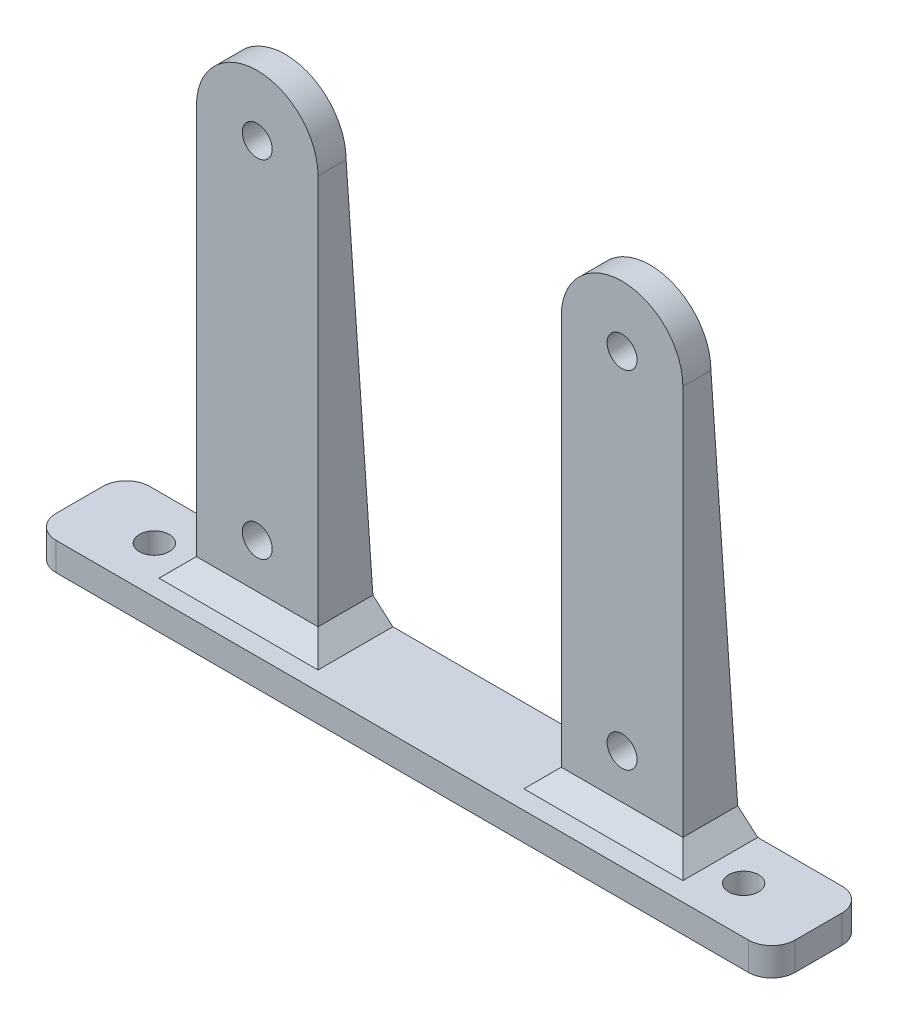
ISO-10303-21;
HEADER;
FILE_DESCRIPTION(('STEP AP214'),'2;1');
FILE_NAME('part.step','',(''),(''),'','','');
FILE_SCHEMA(('AUTOMOTIVE_DESIGN { 1 0 10303 214 1 1 1 1 }'));
ENDSEC;
DATA;
#1=APPLICATION_CONTEXT('core data for automotive mechanical design processes');
#2=APPLICATION_PROTOCOL_DEFINITION('international standard','automotive_design',2000,#1);
#3=PRODUCT_CONTEXT('',#1,'mechanical');
#4=PRODUCT('Part','Part','',(#3));
#5=PRODUCT_RELATED_PRODUCT_CATEGORY('part','',(#4));
#6=PRODUCT_DEFINITION_FORMATION('','',#4);
#7=PRODUCT_DEFINITION_CONTEXT('part definition',#1,'design');
#8=PRODUCT_DEFINITION('design','',#6,#7);
#9=PRODUCT_DEFINITION_SHAPE('','',#8);
#10=(LENGTH_UNIT() NAMED_UNIT(*) SI_UNIT(.MILLI.,.METRE.));
#11=(NAMED_UNIT(*) PLANE_ANGLE_UNIT() SI_UNIT($,.RADIAN.));
#12=(NAMED_UNIT(*) SI_UNIT($,.STERADIAN.) SOLID_ANGLE_UNIT());
#13=UNCERTAINTY_MEASURE_WITH_UNIT(LENGTH_MEASURE(1.E-05),#10,'distance_accuracy_value','');
#14=(GEOMETRIC_REPRESENTATION_CONTEXT(3) GLOBAL_UNCERTAINTY_ASSIGNED_CONTEXT((#13)) GLOBAL_UNIT_ASSIGNED_CONTEXT((#10,
#11,#12)) REPRESENTATION_CONTEXT('',''));
#15=CARTESIAN_POINT('',(0.,0.,0.));
#16=DIRECTION('',(0.,0.,1.));
#17=DIRECTION('',(1.,0.,0.));
#18=AXIS2_PLACEMENT_3D('',#15,#16,#17);
#19=CARTESIAN_POINT('',(0.,3.,0.));
#20=DIRECTION('',(0.,-1.,0.));
#21=DIRECTION('',(0.,0.,-1.));
#22=AXIS2_PLACEMENT_3D('',#19,#20,#21);
#23=PLANE('',#22);
#24=DIRECTION('',(0.,0.,-1.));
#25=VECTOR('',#24,1.);
#26=CARTESIAN_POINT('',(54.5,3.,0.));
#27=LINE('',#26,#25);
#28=CARTESIAN_POINT('',(54.5,3.,-7.));
#29=VERTEX_POINT('',#28);
#30=CARTESIAN_POINT('',(54.5,2.99999999999961,-10.));
#31=VERTEX_POINT('',#30);
#32=EDGE_CURVE('E123',#29,#31,#27,.T.);
#33=ORIENTED_EDGE('',*,*,#32,.F.);
#34=DIRECTION('',(1.,0.,0.));
#35=VECTOR('',#34,1.);
#36=CARTESIAN_POINT('',(52.5,3.,-7.));
#37=LINE('',#36,#35);
#38=CARTESIAN_POINT('',(63.5,3.,-7.));
#39=VERTEX_POINT('',#38);
#40=EDGE_CURVE('E90',#29,#39,#37,.T.);
#41=ORIENTED_EDGE('',*,*,#40,.T.);
#42=DIRECTION('',(0.,0.,1.));
#43=VECTOR('',#42,1.);
#44=CARTESIAN_POINT('',(63.5,3.,0.));
#45=LINE('',#44,#43);
#46=CARTESIAN_POINT('',(63.5,3.00000000000003,-10.));
#47=VERTEX_POINT('',#46);
#48=EDGE_CURVE('E166',#47,#39,#45,.T.);
#49=ORIENTED_EDGE('',*,*,#48,.F.);
#50=DIRECTION('',(-1.,0.,0.));
#51=VECTOR('',#50,1.);
#52=CARTESIAN_POINT('',(0.,3.,-10.));
#53=LINE('',#52,#51);
#54=EDGE_CURVE('E290',#47,#31,#53,.T.);
#55=ORIENTED_EDGE('',*,*,#54,.T.);
#56=EDGE_LOOP('',(#33,#41,#49,#55));
#57=FACE_BOUND('',#56,.T.);
#58=ADVANCED_FACE('F37',(#57),#23,.F.);
#59=DIRECTION('',(0.,0.,1.));
#60=VECTOR('',#59,1.);
#61=CARTESIAN_POINT('',(24.5,3.,0.));
#62=LINE('',#61,#60);
#63=CARTESIAN_POINT('',(24.5,3.,-10.));
#64=VERTEX_POINT('',#63);
#65=CARTESIAN_POINT('',(24.5,3.,-7.));
#66=VERTEX_POINT('',#65);
#67=EDGE_CURVE('E222',#64,#66,#62,.T.);
#68=ORIENTED_EDGE('',*,*,#67,.F.);
#69=CARTESIAN_POINT('',(15.5,3.,-10.));
#70=VERTEX_POINT('',#69);
#71=EDGE_CURVE('E292',#64,#70,#53,.T.);
#72=ORIENTED_EDGE('',*,*,#71,.T.);
#73=DIRECTION('',(0.,0.,-1.));
#74=VECTOR('',#73,1.);
#75=CARTESIAN_POINT('',(15.5,3.,0.));
#76=LINE('',#75,#74);
#77=CARTESIAN_POINT('',(15.5,3.,-7.));
#78=VERTEX_POINT('',#77);
#79=EDGE_CURVE('E240',#78,#70,#76,.T.);
#80=ORIENTED_EDGE('',*,*,#79,.F.);
#81=DIRECTION('',(-1.,0.,0.));
#82=VECTOR('',#81,1.);
#83=CARTESIAN_POINT('',(26.5,3.,-7.));
#84=LINE('',#83,#82);
#85=EDGE_CURVE('E258',#66,#78,#84,.T.);
#86=ORIENTED_EDGE('',*,*,#85,.F.);
#87=EDGE_LOOP('',(#68,#72,#80,#86));
#88=FACE_BOUND('',#87,.T.);
#89=ADVANCED_FACE('F552',(#88),#23,.F.);
#90=DIRECTION('',(-1.,0.,0.));
#91=VECTOR('',#90,1.);
#92=CARTESIAN_POINT('',(0.,3.,-2.));
#93=LINE('',#92,#91);
#94=CARTESIAN_POINT('',(67.5,3.,-2.));
#95=VERTEX_POINT('',#94);
#96=CARTESIAN_POINT('',(50.5,3.,-2.));
#97=VERTEX_POINT('',#96);
#98=EDGE_CURVE('E374',#95,#97,#93,.T.);
#99=ORIENTED_EDGE('',*,*,#98,.T.);
#100=DIRECTION('',(0.,0.,-1.));
#101=VECTOR('',#100,1.);
#102=CARTESIAN_POINT('',(50.5,3.,0.));
#103=LINE('',#102,#101);
#104=CARTESIAN_POINT('',(50.5,3.00000000000001,-10.));
#105=VERTEX_POINT('',#104);
#106=EDGE_CURVE('E130',#97,#105,#103,.T.);
#107=ORIENTED_EDGE('',*,*,#106,.T.);
#108=CARTESIAN_POINT('',(28.5,3.,-10.));
#109=VERTEX_POINT('',#108);
#110=EDGE_CURVE('E291',#105,#109,#53,.T.);
#111=ORIENTED_EDGE('',*,*,#110,.T.);
#112=DIRECTION('',(0.,0.,1.));
#113=VECTOR('',#112,1.);
#114=CARTESIAN_POINT('',(28.5,3.,-4.));
#115=LINE('',#114,#113);
#116=CARTESIAN_POINT('',(28.5,3.,-2.00000000000001));
#117=VERTEX_POINT('',#116);
#118=EDGE_CURVE('E359',#109,#117,#115,.T.);
#119=ORIENTED_EDGE('',*,*,#118,.T.);
#120=DIRECTION('',(-1.,0.,0.));
#121=VECTOR('',#120,1.);
#122=CARTESIAN_POINT('',(13.5,3.,-2.00000000000001));
#123=LINE('',#122,#121);
#124=CARTESIAN_POINT('',(11.5,3.,-2.00000000000001));
#125=VERTEX_POINT('',#124);
#126=EDGE_CURVE('E353',#117,#125,#123,.T.);
#127=ORIENTED_EDGE('',*,*,#126,.T.);
#128=DIRECTION('',(0.,0.,-1.));
#129=VECTOR('',#128,1.);
#130=CARTESIAN_POINT('',(11.5,3.,-10.));
#131=LINE('',#130,#129);
#132=CARTESIAN_POINT('',(11.5,3.00000000000003,-10.));
#133=VERTEX_POINT('',#132);
#134=EDGE_CURVE('E356',#125,#133,#131,.T.);
#135=ORIENTED_EDGE('',*,*,#134,.T.);
#136=CARTESIAN_POINT('',(2.5,3.,-10.));
#137=VERTEX_POINT('',#136);
#138=EDGE_CURVE('E286',#133,#137,#53,.T.);
#139=ORIENTED_EDGE('',*,*,#138,.T.);
#140=CARTESIAN_POINT('',(2.5,3.,-7.5));
#141=DIRECTION('',(0.,-1.,0.));
#142=DIRECTION('',(0.,0.,-1.));
#143=AXIS2_PLACEMENT_3D('',#140,#141,#142);
#144=CIRCLE('',#143,2.5);
#145=CARTESIAN_POINT('',(0.,3.,-7.5));
#146=VERTEX_POINT('',#145);
#147=EDGE_CURVE('E335',#137,#146,#144,.F.);
#148=ORIENTED_EDGE('',*,*,#147,.T.);
#149=DIRECTION('',(0.,0.,1.));
#150=VECTOR('',#149,1.);
#151=CARTESIAN_POINT('',(0.,3.,0.));
#152=LINE('',#151,#150);
#153=CARTESIAN_POINT('',(0.,3.,-2.5));
#154=VERTEX_POINT('',#153);
#155=EDGE_CURVE('E276',#146,#154,#152,.T.);
#156=ORIENTED_EDGE('',*,*,#155,.T.);
#157=CARTESIAN_POINT('',(2.5,3.,-2.5));
#158=DIRECTION('',(0.,-1.,0.));
#159=DIRECTION('',(0.,0.,-1.));
#160=AXIS2_PLACEMENT_3D('',#157,#158,#159);
#161=CIRCLE('',#160,2.5);
#162=CARTESIAN_POINT('',(2.5,3.,0.));
#163=VERTEX_POINT('',#162);
#164=EDGE_CURVE('E326',#154,#163,#161,.F.);
#165=ORIENTED_EDGE('',*,*,#164,.T.);
#166=DIRECTION('',(1.,0.,0.));
#167=VECTOR('',#166,1.);
#168=CARTESIAN_POINT('',(0.,3.,0.));
#169=LINE('',#168,#167);
#170=CARTESIAN_POINT('',(76.5,3.,0.));
#171=VERTEX_POINT('',#170);
#172=EDGE_CURVE('E279',#163,#171,#169,.T.);
#173=ORIENTED_EDGE('',*,*,#172,.T.);
#174=CARTESIAN_POINT('',(76.5,3.,-2.5));
#175=DIRECTION('',(0.,-1.,0.));
#176=DIRECTION('',(0.,0.,-1.));
#177=AXIS2_PLACEMENT_3D('',#174,#175,#176);
#178=CIRCLE('',#177,2.5);
#179=CARTESIAN_POINT('',(79.,3.,-2.5));
#180=VERTEX_POINT('',#179);
#181=EDGE_CURVE('E329',#171,#180,#178,.F.);
#182=ORIENTED_EDGE('',*,*,#181,.T.);
#183=DIRECTION('',(0.,0.,-1.));
#184=VECTOR('',#183,1.);
#185=CARTESIAN_POINT('',(79.,3.,0.));
#186=LINE('',#185,#184);
#187=CARTESIAN_POINT('',(79.,3.,-7.5));
#188=VERTEX_POINT('',#187);
#189=EDGE_CURVE('E283',#180,#188,#186,.T.);
#190=ORIENTED_EDGE('',*,*,#189,.T.);
#191=CARTESIAN_POINT('',(76.5,3.,-7.5));
#192=DIRECTION('',(0.,-1.,0.));
#193=DIRECTION('',(0.,0.,-1.));
#194=AXIS2_PLACEMENT_3D('',#191,#192,#193);
#195=CIRCLE('',#194,2.5);
#196=CARTESIAN_POINT('',(76.5,3.,-10.));
#197=VERTEX_POINT('',#196);
#198=EDGE_CURVE('E332',#188,#197,#195,.F.);
#199=ORIENTED_EDGE('',*,*,#198,.T.);
#200=CARTESIAN_POINT('',(67.5,3.,-10.));
#201=VERTEX_POINT('',#200);
#202=EDGE_CURVE('E287',#197,#201,#53,.T.);
#203=ORIENTED_EDGE('',*,*,#202,.T.);
#204=DIRECTION('',(0.,0.,1.));
#205=VECTOR('',#204,1.);
#206=CARTESIAN_POINT('',(67.5,3.,0.));
#207=LINE('',#206,#205);
#208=EDGE_CURVE('E133',#201,#95,#207,.T.);
#209=ORIENTED_EDGE('',*,*,#208,.T.);
#210=EDGE_LOOP('',(#99,#107,#111,#119,#127,#135,#139,#148,#156,#165,#173,#182,#190,#199,#203,#209));
#211=FACE_BOUND('',#210,.T.);
#212=CARTESIAN_POINT('',(8.,3.,-5.));
#213=DIRECTION('',(0.,1.,0.));
#214=DIRECTION('',(0.,0.,1.));
#215=AXIS2_PLACEMENT_3D('',#212,#213,#214);
#216=CIRCLE('',#215,1.6);
#217=CARTESIAN_POINT('',(8.,3.,-3.4));
#218=VERTEX_POINT('',#217);
#219=EDGE_CURVE('E203',#218,#218,#216,.T.);
#220=ORIENTED_EDGE('',*,*,#219,.F.);
#221=EDGE_LOOP('',(#220));
#222=FACE_BOUND('',#221,.T.);
#223=CARTESIAN_POINT('',(71.,3.,-5.));
#224=DIRECTION('',(0.,1.,0.));
#225=DIRECTION('',(0.,0.,1.));
#226=AXIS2_PLACEMENT_3D('',#223,#224,#225);
#227=CIRCLE('',#226,1.60000000000001);
#228=CARTESIAN_POINT('',(71.,3.,-3.4));
#229=VERTEX_POINT('',#228);
#230=EDGE_CURVE('E197',#229,#229,#227,.T.);
#231=ORIENTED_EDGE('',*,*,#230,.F.);
#232=EDGE_LOOP('',(#231));
#233=FACE_BOUND('',#232,.T.);
#234=ADVANCED_FACE('F381',(#211,#222,#233),#23,.F.);
#235=CARTESIAN_POINT('',(0.,3.,0.));
#236=DIRECTION('',(1.,0.,0.));
#237=DIRECTION('',(0.,0.,-1.));
#238=AXIS2_PLACEMENT_3D('',#235,#236,#237);
#239=PLANE('',#238);
#240=ORIENTED_EDGE('',*,*,#155,.F.);
#241=DIRECTION('',(0.,-1.,0.));
#242=VECTOR('',#241,1.);
#243=CARTESIAN_POINT('',(0.,3.,-7.5));
#244=LINE('',#243,#242);
#245=CARTESIAN_POINT('',(0.,0.,-7.5));
#246=VERTEX_POINT('',#245);
#247=EDGE_CURVE('E305',#146,#246,#244,.T.);
#248=ORIENTED_EDGE('',*,*,#247,.T.);
#249=DIRECTION('',(0.,0.,1.));
#250=VECTOR('',#249,1.);
#251=CARTESIAN_POINT('',(0.,0.,0.));
#252=LINE('',#251,#250);
#253=CARTESIAN_POINT('',(0.,0.,-2.5));
#254=VERTEX_POINT('',#253);
#255=EDGE_CURVE('E275',#246,#254,#252,.T.);
#256=ORIENTED_EDGE('',*,*,#255,.T.);
#257=DIRECTION('',(0.,-1.,0.));
#258=VECTOR('',#257,1.);
#259=CARTESIAN_POINT('',(0.,3.,-2.5));
#260=LINE('',#259,#258);
#261=EDGE_CURVE('E289',#254,#154,#260,.F.);
#262=ORIENTED_EDGE('',*,*,#261,.T.);
#263=EDGE_LOOP('',(#240,#248,#256,#262));
#264=FACE_BOUND('',#263,.T.);
#265=ADVANCED_FACE('F421',(#264),#239,.F.);
#266=CARTESIAN_POINT('',(0.,3.,0.));
#267=DIRECTION('',(0.,0.,-1.));
#268=DIRECTION('',(-1.,0.,0.));
#269=AXIS2_PLACEMENT_3D('',#266,#267,#268);
#270=PLANE('',#269);
#271=DIRECTION('',(1.,0.,0.));
#272=VECTOR('',#271,1.);
#273=CARTESIAN_POINT('',(0.,0.,0.));
#274=LINE('',#273,#272);
#275=CARTESIAN_POINT('',(2.5,0.,0.));
#276=VERTEX_POINT('',#275);
#277=CARTESIAN_POINT('',(76.5,0.,0.));
#278=VERTEX_POINT('',#277);
#279=EDGE_CURVE('E295',#276,#278,#274,.T.);
#280=ORIENTED_EDGE('',*,*,#279,.T.);
#281=DIRECTION('',(0.,-1.,0.));
#282=VECTOR('',#281,1.);
#283=CARTESIAN_POINT('',(76.5,3.,0.));
#284=LINE('',#283,#282);
#285=EDGE_CURVE('E347',#278,#171,#284,.F.);
#286=ORIENTED_EDGE('',*,*,#285,.T.);
#287=ORIENTED_EDGE('',*,*,#172,.F.);
#288=DIRECTION('',(0.,-1.,0.));
#289=VECTOR('',#288,1.);
#290=CARTESIAN_POINT('',(2.5,3.,0.));
#291=LINE('',#290,#289);
#292=EDGE_CURVE('E344',#163,#276,#291,.T.);
#293=ORIENTED_EDGE('',*,*,#292,.T.);
#294=EDGE_LOOP('',(#280,#286,#287,#293));
#295=FACE_BOUND('',#294,.T.);
#296=ADVANCED_FACE('F442',(#295),#270,.F.);
#297=CARTESIAN_POINT('',(79.,3.,0.));
#298=DIRECTION('',(-1.,0.,0.));
#299=DIRECTION('',(0.,0.,1.));
#300=AXIS2_PLACEMENT_3D('',#297,#298,#299);
#301=PLANE('',#300);
#302=DIRECTION('',(0.,0.,-1.));
#303=VECTOR('',#302,1.);
#304=CARTESIAN_POINT('',(79.,0.,0.));
#305=LINE('',#304,#303);
#306=CARTESIAN_POINT('',(79.,0.,-2.5));
#307=VERTEX_POINT('',#306);
#308=CARTESIAN_POINT('',(79.,0.,-7.5));
#309=VERTEX_POINT('',#308);
#310=EDGE_CURVE('E298',#307,#309,#305,.T.);
#311=ORIENTED_EDGE('',*,*,#310,.T.);
#312=DIRECTION('',(0.,-1.,0.));
#313=VECTOR('',#312,1.);
#314=CARTESIAN_POINT('',(79.,3.,-7.5));
#315=LINE('',#314,#313);
#316=EDGE_CURVE('E341',#309,#188,#315,.F.);
#317=ORIENTED_EDGE('',*,*,#316,.T.);
#318=ORIENTED_EDGE('',*,*,#189,.F.);
#319=DIRECTION('',(0.,-1.,0.));
#320=VECTOR('',#319,1.);
#321=CARTESIAN_POINT('',(79.,3.,-2.5));
#322=LINE('',#321,#320);
#323=EDGE_CURVE('E338',#180,#307,#322,.T.);
#324=ORIENTED_EDGE('',*,*,#323,.T.);
#325=EDGE_LOOP('',(#311,#317,#318,#324));
#326=FACE_BOUND('',#325,.T.);
#327=ADVANCED_FACE('F538',(#326),#301,.F.);
#328=CARTESIAN_POINT('',(0.,3.,-10.));
#329=DIRECTION('',(0.,0.,1.));
#330=DIRECTION('',(1.,0.,0.));
#331=AXIS2_PLACEMENT_3D('',#328,#329,#330);
#332=PLANE('',#331);
#333=ORIENTED_EDGE('',*,*,#110,.F.);
#334=DIRECTION('',(-1.,0.,0.));
#335=VECTOR('',#334,1.);
#336=CARTESIAN_POINT('',(0.,3.00000000000001,-10.));
#337=LINE('',#336,#335);
#338=EDGE_CURVE('E78',#31,#105,#337,.T.);
#339=ORIENTED_EDGE('',*,*,#338,.F.);
#340=ORIENTED_EDGE('',*,*,#54,.F.);
#341=DIRECTION('',(-1.,0.,0.));
#342=VECTOR('',#341,1.);
#343=CARTESIAN_POINT('',(0.,3.00000000000003,-10.));
#344=LINE('',#343,#342);
#345=EDGE_CURVE('E55',#201,#47,#344,.T.);
#346=ORIENTED_EDGE('',*,*,#345,.F.);
#347=ORIENTED_EDGE('',*,*,#202,.F.);
#348=DIRECTION('',(0.,-1.,0.));
#349=VECTOR('',#348,1.);
#350=CARTESIAN_POINT('',(76.5,3.,-10.));
#351=LINE('',#350,#349);
#352=CARTESIAN_POINT('',(76.5,0.,-10.));
#353=VERTEX_POINT('',#352);
#354=EDGE_CURVE('E320',#197,#353,#351,.T.);
#355=ORIENTED_EDGE('',*,*,#354,.T.);
#356=DIRECTION('',(-1.,0.,0.));
#357=VECTOR('',#356,1.);
#358=CARTESIAN_POINT('',(0.,0.,-10.));
#359=LINE('',#358,#357);
#360=CARTESIAN_POINT('',(2.5,0.,-10.));
#361=VERTEX_POINT('',#360);
#362=EDGE_CURVE('E280',#353,#361,#359,.T.);
#363=ORIENTED_EDGE('',*,*,#362,.T.);
#364=DIRECTION('',(0.,-1.,0.));
#365=VECTOR('',#364,1.);
#366=CARTESIAN_POINT('',(2.5,3.,-10.));
#367=LINE('',#366,#365);
#368=EDGE_CURVE('E323',#361,#137,#367,.F.);
#369=ORIENTED_EDGE('',*,*,#368,.T.);
#370=ORIENTED_EDGE('',*,*,#138,.F.);
#371=DIRECTION('',(1.,0.,0.));
#372=VECTOR('',#371,1.);
#373=CARTESIAN_POINT('',(0.,3.00000000000003,-10.));
#374=LINE('',#373,#372);
#375=EDGE_CURVE('E251',#70,#133,#374,.F.);
#376=ORIENTED_EDGE('',*,*,#375,.F.);
#377=ORIENTED_EDGE('',*,*,#71,.F.);
#378=DIRECTION('',(1.,0.,0.));
#379=VECTOR('',#378,1.);
#380=CARTESIAN_POINT('',(0.,3.00000000000001,-10.));
#381=LINE('',#380,#379);
#382=EDGE_CURVE('E233',#109,#64,#381,.F.);
#383=ORIENTED_EDGE('',*,*,#382,.F.);
#384=EDGE_LOOP('',(#333,#339,#340,#346,#347,#355,#363,#369,#370,#376,#377,#383));
#385=FACE_BOUND('',#384,.T.);
#386=ADVANCED_FACE('F388',(#385),#332,.F.);
#387=CARTESIAN_POINT('',(0.,0.,0.));
#388=DIRECTION('',(0.,-1.,0.));
#389=DIRECTION('',(0.,0.,-1.));
#390=AXIS2_PLACEMENT_3D('',#387,#388,#389);
#391=PLANE('',#390);
#392=CARTESIAN_POINT('',(2.5,0.,-7.5));
#393=DIRECTION('',(0.,-1.,0.));
#394=DIRECTION('',(0.,0.,-1.));
#395=AXIS2_PLACEMENT_3D('',#392,#393,#394);
#396=CIRCLE('',#395,2.5);
#397=EDGE_CURVE('E317',#246,#361,#396,.T.);
#398=ORIENTED_EDGE('',*,*,#397,.T.);
#399=ORIENTED_EDGE('',*,*,#362,.F.);
#400=CARTESIAN_POINT('',(76.5,0.,-7.5));
#401=DIRECTION('',(0.,-1.,0.));
#402=DIRECTION('',(0.,0.,-1.));
#403=AXIS2_PLACEMENT_3D('',#400,#401,#402);
#404=CIRCLE('',#403,2.5);
#405=EDGE_CURVE('E314',#353,#309,#404,.T.);
#406=ORIENTED_EDGE('',*,*,#405,.T.);
#407=ORIENTED_EDGE('',*,*,#310,.F.);
#408=CARTESIAN_POINT('',(76.5,0.,-2.5));
#409=DIRECTION('',(0.,-1.,0.));
#410=DIRECTION('',(0.,0.,-1.));
#411=AXIS2_PLACEMENT_3D('',#408,#409,#410);
#412=CIRCLE('',#411,2.5);
#413=EDGE_CURVE('E311',#307,#278,#412,.T.);
#414=ORIENTED_EDGE('',*,*,#413,.T.);
#415=ORIENTED_EDGE('',*,*,#279,.F.);
#416=CARTESIAN_POINT('',(2.5,0.,-2.5));
#417=DIRECTION('',(0.,-1.,0.));
#418=DIRECTION('',(0.,0.,-1.));
#419=AXIS2_PLACEMENT_3D('',#416,#417,#418);
#420=CIRCLE('',#419,2.5);
#421=EDGE_CURVE('E308',#276,#254,#420,.T.);
#422=ORIENTED_EDGE('',*,*,#421,.T.);
#423=ORIENTED_EDGE('',*,*,#255,.F.);
#424=EDGE_LOOP('',(#398,#399,#406,#407,#414,#415,#422,#423));
#425=FACE_BOUND('',#424,.T.);
#426=CARTESIAN_POINT('',(8.,0.,-5.));
#427=DIRECTION('',(0.,1.,0.));
#428=DIRECTION('',(0.,0.,1.));
#429=AXIS2_PLACEMENT_3D('',#426,#427,#428);
#430=CIRCLE('',#429,1.6);
#431=CARTESIAN_POINT('',(8.,0.,-3.4));
#432=VERTEX_POINT('',#431);
#433=EDGE_CURVE('E200',#432,#432,#430,.T.);
#434=ORIENTED_EDGE('',*,*,#433,.T.);
#435=EDGE_LOOP('',(#434));
#436=FACE_BOUND('',#435,.T.);
#437=CARTESIAN_POINT('',(71.,0.,-5.));
#438=DIRECTION('',(0.,1.,0.));
#439=DIRECTION('',(0.,0.,1.));
#440=AXIS2_PLACEMENT_3D('',#437,#438,#439);
#441=CIRCLE('',#440,1.60000000000001);
#442=CARTESIAN_POINT('',(71.,0.,-3.4));
#443=VERTEX_POINT('',#442);
#444=EDGE_CURVE('E193',#443,#443,#441,.T.);
#445=ORIENTED_EDGE('',*,*,#444,.T.);
#446=EDGE_LOOP('',(#445));
#447=FACE_BOUND('',#446,.T.);
#448=ADVANCED_FACE('F426',(#425,#436,#447),#391,.T.);
#449=CARTESIAN_POINT('',(13.5,46.75,-7.));
#450=DIRECTION('',(1.,0.,0.));
#451=DIRECTION('',(0.,0.,-1.));
#452=AXIS2_PLACEMENT_3D('',#449,#450,#451);
#453=PLANE('',#452);
#454=DIRECTION('',(0.,0.997657238183404,0.068410782046862));
#455=VECTOR('',#454,1.);
#456=CARTESIAN_POINT('',(13.5,3.,-10.));
#457=LINE('',#456,#455);
#458=CARTESIAN_POINT('',(13.5,5.,-9.86285714285714));
#459=VERTEX_POINT('',#458);
#460=CARTESIAN_POINT('',(13.5,46.75,-7.));
#461=VERTEX_POINT('',#460);
#462=EDGE_CURVE('E237',#459,#461,#457,.T.);
#463=ORIENTED_EDGE('',*,*,#462,.F.);
#464=DIRECTION('',(0.,0.,1.));
#465=VECTOR('',#464,1.);
#466=CARTESIAN_POINT('',(13.5,5.,-4.));
#467=LINE('',#466,#465);
#468=CARTESIAN_POINT('',(13.5,5.,-4.));
#469=VERTEX_POINT('',#468);
#470=EDGE_CURVE('E362',#459,#469,#467,.T.);
#471=ORIENTED_EDGE('',*,*,#470,.T.);
#472=DIRECTION('',(0.,-1.,0.));
#473=VECTOR('',#472,1.);
#474=CARTESIAN_POINT('',(13.5,46.75,-4.));
#475=LINE('',#474,#473);
#476=CARTESIAN_POINT('',(13.5,46.75,-4.));
#477=VERTEX_POINT('',#476);
#478=EDGE_CURVE('E272',#477,#469,#475,.T.);
#479=ORIENTED_EDGE('',*,*,#478,.F.);
#480=DIRECTION('',(0.,0.,1.));
#481=VECTOR('',#480,1.);
#482=CARTESIAN_POINT('',(13.5,46.75,-7.));
#483=LINE('',#482,#481);
#484=EDGE_CURVE('E261',#461,#477,#483,.T.);
#485=ORIENTED_EDGE('',*,*,#484,.F.);
#486=EDGE_LOOP('',(#463,#471,#479,#485));
#487=FACE_BOUND('',#486,.T.);
#488=ADVANCED_FACE('F476',(#487),#453,.F.);
#489=CARTESIAN_POINT('',(13.5,46.75,-4.));
#490=DIRECTION('',(0.,0.,-1.));
#491=DIRECTION('',(-1.,0.,0.));
#492=AXIS2_PLACEMENT_3D('',#489,#490,#491);
#493=PLANE('',#492);
#494=CARTESIAN_POINT('',(20.,9.75,-4.));
#495=DIRECTION('',(0.,0.,1.));
#496=DIRECTION('',(1.,0.,0.));
#497=AXIS2_PLACEMENT_3D('',#494,#495,#496);
#498=CIRCLE('',#497,1.6);
#499=CARTESIAN_POINT('',(21.6,9.75,-4.));
#500=VERTEX_POINT('',#499);
#501=EDGE_CURVE('E211',#500,#500,#498,.T.);
#502=ORIENTED_EDGE('',*,*,#501,.F.);
#503=EDGE_LOOP('',(#502));
#504=FACE_BOUND('',#503,.T.);
#505=CARTESIAN_POINT('',(20.,46.75,-4.));
#506=DIRECTION('',(0.,0.,1.));
#507=DIRECTION('',(1.,0.,0.));
#508=AXIS2_PLACEMENT_3D('',#505,#506,#507);
#509=CIRCLE('',#508,1.6);
#510=CARTESIAN_POINT('',(21.6,46.75,-4.));
#511=VERTEX_POINT('',#510);
#512=EDGE_CURVE('E196',#511,#511,#509,.T.);
#513=ORIENTED_EDGE('',*,*,#512,.F.);
#514=EDGE_LOOP('',(#513));
#515=FACE_BOUND('',#514,.T.);
#516=ORIENTED_EDGE('',*,*,#478,.T.);
#517=DIRECTION('',(1.,0.,0.));
#518=VECTOR('',#517,1.);
#519=CARTESIAN_POINT('',(26.5,5.,-4.));
#520=LINE('',#519,#518);
#521=CARTESIAN_POINT('',(26.5,5.,-4.));
#522=VERTEX_POINT('',#521);
#523=EDGE_CURVE('E365',#469,#522,#520,.T.);
#524=ORIENTED_EDGE('',*,*,#523,.T.);
#525=DIRECTION('',(0.,-1.,0.));
#526=VECTOR('',#525,1.);
#527=CARTESIAN_POINT('',(26.5,46.75,-4.));
#528=LINE('',#527,#526);
#529=CARTESIAN_POINT('',(26.5,46.75,-4.));
#530=VERTEX_POINT('',#529);
#531=EDGE_CURVE('E267',#530,#522,#528,.T.);
#532=ORIENTED_EDGE('',*,*,#531,.F.);
#533=CARTESIAN_POINT('',(20.,46.75,-4.));
#534=DIRECTION('',(0.,0.,1.));
#535=DIRECTION('',(1.,0.,0.));
#536=AXIS2_PLACEMENT_3D('',#533,#534,#535);
#537=CIRCLE('',#536,6.5);
#538=EDGE_CURVE('E254',#530,#477,#537,.T.);
#539=ORIENTED_EDGE('',*,*,#538,.T.);
#540=EDGE_LOOP('',(#516,#524,#532,#539));
#541=FACE_BOUND('',#540,.T.);
#542=ADVANCED_FACE('F488',(#504,#515,#541),#493,.F.);
#543=CARTESIAN_POINT('',(26.5,46.75,-7.));
#544=DIRECTION('',(-1.,0.,0.));
#545=DIRECTION('',(0.,0.,1.));
#546=AXIS2_PLACEMENT_3D('',#543,#544,#545);
#547=PLANE('',#546);
#548=ORIENTED_EDGE('',*,*,#531,.T.);
#549=DIRECTION('',(0.,0.,-1.));
#550=VECTOR('',#549,1.);
#551=CARTESIAN_POINT('',(26.5,5.,-10.));
#552=LINE('',#551,#550);
#553=CARTESIAN_POINT('',(26.5,5.00000000000001,-9.86285714285714));
#554=VERTEX_POINT('',#553);
#555=EDGE_CURVE('E350',#522,#554,#552,.T.);
#556=ORIENTED_EDGE('',*,*,#555,.T.);
#557=DIRECTION('',(0.,-0.997657238183404,-0.068410782046862));
#558=VECTOR('',#557,1.);
#559=CARTESIAN_POINT('',(26.5,46.75,-7.));
#560=LINE('',#559,#558);
#561=CARTESIAN_POINT('',(26.5,46.75,-7.));
#562=VERTEX_POINT('',#561);
#563=EDGE_CURVE('E219',#562,#554,#560,.T.);
#564=ORIENTED_EDGE('',*,*,#563,.F.);
#565=DIRECTION('',(0.,0.,-1.));
#566=VECTOR('',#565,1.);
#567=CARTESIAN_POINT('',(26.5,46.75,-7.));
#568=LINE('',#567,#566);
#569=EDGE_CURVE('E264',#530,#562,#568,.T.);
#570=ORIENTED_EDGE('',*,*,#569,.F.);
#571=EDGE_LOOP('',(#548,#556,#564,#570));
#572=FACE_BOUND('',#571,.T.);
#573=ADVANCED_FACE('F493',(#572),#547,.F.);
#574=CARTESIAN_POINT('',(26.5,46.75,-7.));
#575=DIRECTION('',(0.,0.,1.));
#576=DIRECTION('',(1.,0.,0.));
#577=AXIS2_PLACEMENT_3D('',#574,#575,#576);
#578=PLANE('',#577);
#579=CARTESIAN_POINT('',(20.,9.75,-7.));
#580=DIRECTION('',(0.,0.,1.));
#581=DIRECTION('',(1.,0.,0.));
#582=AXIS2_PLACEMENT_3D('',#579,#580,#581);
#583=CIRCLE('',#582,1.6);
#584=CARTESIAN_POINT('',(21.6,9.75,-7.));
#585=VERTEX_POINT('',#584);
#586=EDGE_CURVE('E207',#585,#585,#583,.T.);
#587=ORIENTED_EDGE('',*,*,#586,.T.);
#588=EDGE_LOOP('',(#587));
#589=FACE_BOUND('',#588,.T.);
#590=CARTESIAN_POINT('',(20.,46.75,-7.));
#591=DIRECTION('',(0.,0.,1.));
#592=DIRECTION('',(1.,0.,0.));
#593=AXIS2_PLACEMENT_3D('',#590,#591,#592);
#594=CIRCLE('',#593,1.6);
#595=CARTESIAN_POINT('',(21.6,46.75,-7.));
#596=VERTEX_POINT('',#595);
#597=EDGE_CURVE('E214',#596,#596,#594,.T.);
#598=ORIENTED_EDGE('',*,*,#597,.T.);
#599=EDGE_LOOP('',(#598));
#600=FACE_BOUND('',#599,.T.);
#601=CARTESIAN_POINT('',(20.,46.75,-7.));
#602=DIRECTION('',(0.,0.,1.));
#603=DIRECTION('',(1.,0.,0.));
#604=AXIS2_PLACEMENT_3D('',#601,#602,#603);
#605=CIRCLE('',#604,6.5);
#606=EDGE_CURVE('E255',#562,#461,#605,.T.);
#607=ORIENTED_EDGE('',*,*,#606,.F.);
#608=DIRECTION('',(1.,0.,0.));
#609=VECTOR('',#608,1.);
#610=CARTESIAN_POINT('',(26.5,46.75,-7.));
#611=LINE('',#610,#609);
#612=CARTESIAN_POINT('',(24.5,46.75,-7.));
#613=VERTEX_POINT('',#612);
#614=EDGE_CURVE('E230',#562,#613,#611,.F.);
#615=ORIENTED_EDGE('',*,*,#614,.T.);
#616=DIRECTION('',(0.,1.,0.));
#617=VECTOR('',#616,1.);
#618=CARTESIAN_POINT('',(24.5,46.75,-7.));
#619=LINE('',#618,#617);
#620=EDGE_CURVE('E227',#66,#613,#619,.T.);
#621=ORIENTED_EDGE('',*,*,#620,.F.);
#622=ORIENTED_EDGE('',*,*,#85,.T.);
#623=DIRECTION('',(0.,-1.,0.));
#624=VECTOR('',#623,1.);
#625=CARTESIAN_POINT('',(15.5,46.75,-7.));
#626=LINE('',#625,#624);
#627=CARTESIAN_POINT('',(15.5,46.7500000000004,-6.99999999999999));
#628=VERTEX_POINT('',#627);
#629=EDGE_CURVE('E245',#628,#78,#626,.T.);
#630=ORIENTED_EDGE('',*,*,#629,.F.);
#631=DIRECTION('',(1.,0.,0.));
#632=VECTOR('',#631,1.);
#633=CARTESIAN_POINT('',(26.5,46.75,-7.));
#634=LINE('',#633,#632);
#635=EDGE_CURVE('E248',#628,#461,#634,.F.);
#636=ORIENTED_EDGE('',*,*,#635,.T.);
#637=EDGE_LOOP('',(#607,#615,#621,#622,#630,#636));
#638=FACE_BOUND('',#637,.T.);
#639=ADVANCED_FACE('F505',(#589,#600,#638),#578,.F.);
#640=CARTESIAN_POINT('',(20.,46.75,-7.));
#641=DIRECTION('',(0.,0.,1.));
#642=DIRECTION('',(1.,0.,0.));
#643=AXIS2_PLACEMENT_3D('',#640,#641,#642);
#644=CYLINDRICAL_SURFACE('',#643,6.5);
#645=ORIENTED_EDGE('',*,*,#569,.T.);
#646=ORIENTED_EDGE('',*,*,#606,.T.);
#647=ORIENTED_EDGE('',*,*,#484,.T.);
#648=ORIENTED_EDGE('',*,*,#538,.F.);
#649=EDGE_LOOP('',(#645,#646,#647,#648));
#650=FACE_BOUND('',#649,.T.);
#651=ADVANCED_FACE('F501',(#650),#644,.T.);
#652=CARTESIAN_POINT('',(13.5,3.,-10.));
#653=DIRECTION('',(0.,-0.0684107820468621,0.997657238183404));
#654=DIRECTION('',(0.,0.997657238183404,0.068410782046862));
#655=AXIS2_PLACEMENT_3D('',#652,#653,#654);
#656=PLANE('',#655);
#657=DIRECTION('',(0.,0.997657238183404,0.068410782046862));
#658=VECTOR('',#657,1.);
#659=CARTESIAN_POINT('',(15.5,3.,-10.));
#660=LINE('',#659,#658);
#661=EDGE_CURVE('E236',#70,#628,#660,.T.);
#662=ORIENTED_EDGE('',*,*,#661,.F.);
#663=ORIENTED_EDGE('',*,*,#375,.T.);
#664=DIRECTION('',(0.706277032730245,0.706277032730251,0.048430425101503));
#665=VECTOR('',#664,1.);
#666=CARTESIAN_POINT('',(13.5979248786526,5.09792487865264,-9.85614229403525));
#667=LINE('',#666,#665);
#668=EDGE_CURVE('E371',#133,#459,#667,.T.);
#669=ORIENTED_EDGE('',*,*,#668,.T.);
#670=ORIENTED_EDGE('',*,*,#462,.T.);
#671=ORIENTED_EDGE('',*,*,#635,.F.);
#672=EDGE_LOOP('',(#662,#663,#669,#670,#671));
#673=FACE_BOUND('',#672,.T.);
#674=ADVANCED_FACE('F469',(#673),#656,.F.);
#675=CARTESIAN_POINT('',(15.5,26.625,-5.));
#676=DIRECTION('',(-1.,0.,0.));
#677=DIRECTION('',(0.,0.,1.));
#678=AXIS2_PLACEMENT_3D('',#675,#676,#677);
#679=PLANE('',#678);
#680=ORIENTED_EDGE('',*,*,#661,.T.);
#681=ORIENTED_EDGE('',*,*,#629,.T.);
#682=ORIENTED_EDGE('',*,*,#79,.T.);
#683=EDGE_LOOP('',(#680,#681,#682));
#684=FACE_BOUND('',#683,.T.);
#685=ADVANCED_FACE('F592',(#684),#679,.F.);
#686=CARTESIAN_POINT('',(26.5,46.75,-7.));
#687=DIRECTION('',(0.,-0.068410782046862,0.997657238183404));
#688=DIRECTION('',(0.,-0.997657238183404,-0.068410782046862));
#689=AXIS2_PLACEMENT_3D('',#686,#687,#688);
#690=PLANE('',#689);
#691=ORIENTED_EDGE('',*,*,#563,.T.);
#692=DIRECTION('',(0.706277032730245,-0.706277032730251,-0.048430425101503));
#693=VECTOR('',#692,1.);
#694=CARTESIAN_POINT('',(26.4020751213474,5.09792487865264,-9.85614229403525));
#695=LINE('',#694,#693);
#696=EDGE_CURVE('E368',#554,#109,#695,.T.);
#697=ORIENTED_EDGE('',*,*,#696,.T.);
#698=ORIENTED_EDGE('',*,*,#382,.T.);
#699=DIRECTION('',(0.,-0.997657238183404,-0.068410782046862));
#700=VECTOR('',#699,1.);
#701=CARTESIAN_POINT('',(24.5,46.75,-7.));
#702=LINE('',#701,#700);
#703=EDGE_CURVE('E210',#613,#64,#702,.T.);
#704=ORIENTED_EDGE('',*,*,#703,.F.);
#705=ORIENTED_EDGE('',*,*,#614,.F.);
#706=EDGE_LOOP('',(#691,#697,#698,#704,#705));
#707=FACE_BOUND('',#706,.T.);
#708=ADVANCED_FACE('F511',(#707),#690,.F.);
#709=CARTESIAN_POINT('',(24.5,26.625,-5.));
#710=DIRECTION('',(1.,0.,0.));
#711=DIRECTION('',(0.,0.,-1.));
#712=AXIS2_PLACEMENT_3D('',#709,#710,#711);
#713=PLANE('',#712);
#714=ORIENTED_EDGE('',*,*,#67,.T.);
#715=ORIENTED_EDGE('',*,*,#620,.T.);
#716=ORIENTED_EDGE('',*,*,#703,.T.);
#717=EDGE_LOOP('',(#714,#715,#716));
#718=FACE_BOUND('',#717,.T.);
#719=ADVANCED_FACE('F515',(#718),#713,.F.);
#720=CARTESIAN_POINT('',(20.,46.75,-7.));
#721=DIRECTION('',(0.,0.,1.));
#722=DIRECTION('',(1.,0.,0.));
#723=AXIS2_PLACEMENT_3D('',#720,#721,#722);
#724=CYLINDRICAL_SURFACE('',#723,1.6);
#725=ORIENTED_EDGE('',*,*,#597,.F.);
#726=EDGE_LOOP('',(#725));
#727=FACE_BOUND('',#726,.T.);
#728=ORIENTED_EDGE('',*,*,#512,.T.);
#729=EDGE_LOOP('',(#728));
#730=FACE_BOUND('',#729,.T.);
#731=ADVANCED_FACE('F575',(#727,#730),#724,.F.);
#732=CARTESIAN_POINT('',(20.,9.75,-7.));
#733=DIRECTION('',(0.,0.,1.));
#734=DIRECTION('',(1.,0.,0.));
#735=AXIS2_PLACEMENT_3D('',#732,#733,#734);
#736=CYLINDRICAL_SURFACE('',#735,1.6);
#737=ORIENTED_EDGE('',*,*,#586,.F.);
#738=EDGE_LOOP('',(#737));
#739=FACE_BOUND('',#738,.T.);
#740=ORIENTED_EDGE('',*,*,#501,.T.);
#741=EDGE_LOOP('',(#740));
#742=FACE_BOUND('',#741,.T.);
#743=ADVANCED_FACE('F571',(#739,#742),#736,.F.);
#744=CARTESIAN_POINT('',(2.5,3.,-7.5));
#745=DIRECTION('',(0.,-1.,0.));
#746=DIRECTION('',(0.,0.,-1.));
#747=AXIS2_PLACEMENT_3D('',#744,#745,#746);
#748=CYLINDRICAL_SURFACE('',#747,2.5);
#749=ORIENTED_EDGE('',*,*,#147,.F.);
#750=ORIENTED_EDGE('',*,*,#368,.F.);
#751=ORIENTED_EDGE('',*,*,#397,.F.);
#752=ORIENTED_EDGE('',*,*,#247,.F.);
#753=EDGE_LOOP('',(#749,#750,#751,#752));
#754=FACE_BOUND('',#753,.T.);
#755=ADVANCED_FACE('F414',(#754),#748,.T.);
#756=CARTESIAN_POINT('',(76.5,3.,-7.5));
#757=DIRECTION('',(0.,-1.,0.));
#758=DIRECTION('',(0.,0.,-1.));
#759=AXIS2_PLACEMENT_3D('',#756,#757,#758);
#760=CYLINDRICAL_SURFACE('',#759,2.5);
#761=ORIENTED_EDGE('',*,*,#198,.F.);
#762=ORIENTED_EDGE('',*,*,#316,.F.);
#763=ORIENTED_EDGE('',*,*,#405,.F.);
#764=ORIENTED_EDGE('',*,*,#354,.F.);
#765=EDGE_LOOP('',(#761,#762,#763,#764));
#766=FACE_BOUND('',#765,.T.);
#767=ADVANCED_FACE('F535',(#766),#760,.T.);
#768=CARTESIAN_POINT('',(76.5,3.,-2.5));
#769=DIRECTION('',(0.,-1.,0.));
#770=DIRECTION('',(0.,0.,-1.));
#771=AXIS2_PLACEMENT_3D('',#768,#769,#770);
#772=CYLINDRICAL_SURFACE('',#771,2.5);
#773=ORIENTED_EDGE('',*,*,#181,.F.);
#774=ORIENTED_EDGE('',*,*,#285,.F.);
#775=ORIENTED_EDGE('',*,*,#413,.F.);
#776=ORIENTED_EDGE('',*,*,#323,.F.);
#777=EDGE_LOOP('',(#773,#774,#775,#776));
#778=FACE_BOUND('',#777,.T.);
#779=ADVANCED_FACE('F541',(#778),#772,.T.);
#780=CARTESIAN_POINT('',(2.5,3.,-2.5));
#781=DIRECTION('',(0.,-1.,0.));
#782=DIRECTION('',(0.,0.,-1.));
#783=AXIS2_PLACEMENT_3D('',#780,#781,#782);
#784=CYLINDRICAL_SURFACE('',#783,2.5);
#785=ORIENTED_EDGE('',*,*,#164,.F.);
#786=ORIENTED_EDGE('',*,*,#261,.F.);
#787=ORIENTED_EDGE('',*,*,#421,.F.);
#788=ORIENTED_EDGE('',*,*,#292,.F.);
#789=EDGE_LOOP('',(#785,#786,#787,#788));
#790=FACE_BOUND('',#789,.T.);
#791=ADVANCED_FACE('F435',(#790),#784,.T.);
#792=CARTESIAN_POINT('',(8.,0.,-5.));
#793=DIRECTION('',(0.,1.,0.));
#794=DIRECTION('',(0.,0.,1.));
#795=AXIS2_PLACEMENT_3D('',#792,#793,#794);
#796=CYLINDRICAL_SURFACE('',#795,1.6);
#797=ORIENTED_EDGE('',*,*,#433,.F.);
#798=EDGE_LOOP('',(#797));
#799=FACE_BOUND('',#798,.T.);
#800=ORIENTED_EDGE('',*,*,#219,.T.);
#801=EDGE_LOOP('',(#800));
#802=FACE_BOUND('',#801,.T.);
#803=ADVANCED_FACE('F548',(#799,#802),#796,.F.);
#804=CARTESIAN_POINT('',(71.,0.,-5.));
#805=DIRECTION('',(0.,1.,0.));
#806=DIRECTION('',(0.,0.,1.));
#807=AXIS2_PLACEMENT_3D('',#804,#805,#806);
#808=CYLINDRICAL_SURFACE('',#807,1.60000000000001);
#809=ORIENTED_EDGE('',*,*,#444,.F.);
#810=EDGE_LOOP('',(#809));
#811=FACE_BOUND('',#810,.T.);
#812=ORIENTED_EDGE('',*,*,#230,.T.);
#813=EDGE_LOOP('',(#812));
#814=FACE_BOUND('',#813,.T.);
#815=ADVANCED_FACE('F794',(#811,#814),#808,.F.);
#816=CARTESIAN_POINT('',(13.5,5.,-7.));
#817=DIRECTION('',(-0.70710678118655,0.707106781186544,0.));
#818=DIRECTION('',(0.,0.,-1.));
#819=AXIS2_PLACEMENT_3D('',#816,#817,#818);
#820=PLANE('',#819);
#821=ORIENTED_EDGE('',*,*,#668,.F.);
#822=ORIENTED_EDGE('',*,*,#134,.F.);
#823=DIRECTION('',(-0.577350269189624,-0.577350269189629,0.577350269189624));
#824=VECTOR('',#823,1.);
#825=CARTESIAN_POINT('',(13.5,5.,-4.));
#826=LINE('',#825,#824);
#827=EDGE_CURVE('E206',#469,#125,#826,.T.);
#828=ORIENTED_EDGE('',*,*,#827,.F.);
#829=ORIENTED_EDGE('',*,*,#470,.F.);
#830=EDGE_LOOP('',(#821,#822,#828,#829));
#831=FACE_BOUND('',#830,.T.);
#832=ADVANCED_FACE('F479',(#831),#820,.T.);
#833=CARTESIAN_POINT('',(13.5,5.,-4.));
#834=DIRECTION('',(0.,0.707106781186545,0.70710678118655));
#835=DIRECTION('',(-1.,0.,0.));
#836=AXIS2_PLACEMENT_3D('',#833,#834,#835);
#837=PLANE('',#836);
#838=ORIENTED_EDGE('',*,*,#827,.T.);
#839=ORIENTED_EDGE('',*,*,#126,.F.);
#840=DIRECTION('',(-0.577350269189624,0.577350269189629,-0.577350269189624));
#841=VECTOR('',#840,1.);
#842=CARTESIAN_POINT('',(22.1666666666667,9.33333333333335,-8.33333333333331));
#843=LINE('',#842,#841);
#844=EDGE_CURVE('E192',#522,#117,#843,.F.);
#845=ORIENTED_EDGE('',*,*,#844,.F.);
#846=ORIENTED_EDGE('',*,*,#523,.F.);
#847=EDGE_LOOP('',(#838,#839,#845,#846));
#848=FACE_BOUND('',#847,.T.);
#849=ADVANCED_FACE('F484',(#848),#837,.T.);
#850=CARTESIAN_POINT('',(26.5,5.,-7.));
#851=DIRECTION('',(0.70710678118655,0.707106781186545,0.));
#852=DIRECTION('',(0.,0.,1.));
#853=AXIS2_PLACEMENT_3D('',#850,#851,#852);
#854=PLANE('',#853);
#855=ORIENTED_EDGE('',*,*,#844,.T.);
#856=ORIENTED_EDGE('',*,*,#118,.F.);
#857=ORIENTED_EDGE('',*,*,#696,.F.);
#858=ORIENTED_EDGE('',*,*,#555,.F.);
#859=EDGE_LOOP('',(#855,#856,#857,#858));
#860=FACE_BOUND('',#859,.T.);
#861=ADVANCED_FACE('F642',(#860),#854,.T.);
#862=CARTESIAN_POINT('',(65.5,46.75,-7.));
#863=DIRECTION('',(1.,0.,0.));
#864=DIRECTION('',(0.,0.,-1.));
#865=AXIS2_PLACEMENT_3D('',#862,#863,#864);
#866=PLANE('',#865);
#867=DIRECTION('',(0.,-1.,0.));
#868=VECTOR('',#867,1.);
#869=CARTESIAN_POINT('',(65.5,46.75,-4.));
#870=LINE('',#869,#868);
#871=CARTESIAN_POINT('',(65.5,46.75,-4.));
#872=VERTEX_POINT('',#871);
#873=CARTESIAN_POINT('',(65.5,5.00000000000002,-4.));
#874=VERTEX_POINT('',#873);
#875=EDGE_CURVE('E187',#872,#874,#870,.T.);
#876=ORIENTED_EDGE('',*,*,#875,.T.);
#877=DIRECTION('',(0.,0.,-1.));
#878=VECTOR('',#877,1.);
#879=CARTESIAN_POINT('',(65.5,5.00000000000002,-7.));
#880=LINE('',#879,#878);
#881=CARTESIAN_POINT('',(65.5,5.00000000000002,-9.86285714285714));
#882=VERTEX_POINT('',#881);
#883=EDGE_CURVE('E64',#874,#882,#880,.T.);
#884=ORIENTED_EDGE('',*,*,#883,.T.);
#885=DIRECTION('',(0.,0.997657238183404,0.068410782046862));
#886=VECTOR('',#885,1.);
#887=CARTESIAN_POINT('',(65.5,3.,-10.));
#888=LINE('',#887,#886);
#889=CARTESIAN_POINT('',(65.5,46.75,-7.));
#890=VERTEX_POINT('',#889);
#891=EDGE_CURVE('E164',#882,#890,#888,.T.);
#892=ORIENTED_EDGE('',*,*,#891,.T.);
#893=DIRECTION('',(0.,0.,1.));
#894=VECTOR('',#893,1.);
#895=CARTESIAN_POINT('',(65.5,46.75,-7.));
#896=LINE('',#895,#894);
#897=EDGE_CURVE('E183',#890,#872,#896,.T.);
#898=ORIENTED_EDGE('',*,*,#897,.T.);
#899=EDGE_LOOP('',(#876,#884,#892,#898));
#900=FACE_BOUND('',#899,.T.);
#901=ADVANCED_FACE('F636',(#900),#866,.T.);
#902=CARTESIAN_POINT('',(52.5,46.75,-7.));
#903=DIRECTION('',(0.,0.,-1.));
#904=DIRECTION('',(-1.,0.,0.));
#905=AXIS2_PLACEMENT_3D('',#902,#903,#904);
#906=PLANE('',#905);
#907=CARTESIAN_POINT('',(59.,9.75,-7.));
#908=DIRECTION('',(0.,0.,-1.));
#909=DIRECTION('',(-1.,0.,0.));
#910=AXIS2_PLACEMENT_3D('',#907,#908,#909);
#911=CIRCLE('',#910,1.6);
#912=CARTESIAN_POINT('',(57.4,9.75,-7.));
#913=VERTEX_POINT('',#912);
#914=EDGE_CURVE('E154',#913,#913,#911,.T.);
#915=ORIENTED_EDGE('',*,*,#914,.F.);
#916=EDGE_LOOP('',(#915));
#917=FACE_BOUND('',#916,.T.);
#918=CARTESIAN_POINT('',(59.,46.75,-7.));
#919=DIRECTION('',(0.,0.,-1.));
#920=DIRECTION('',(-1.,0.,0.));
#921=AXIS2_PLACEMENT_3D('',#918,#919,#920);
#922=CIRCLE('',#921,1.6);
#923=CARTESIAN_POINT('',(57.4,46.75,-7.));
#924=VERTEX_POINT('',#923);
#925=EDGE_CURVE('E144',#924,#924,#922,.T.);
#926=ORIENTED_EDGE('',*,*,#925,.F.);
#927=EDGE_LOOP('',(#926));
#928=FACE_BOUND('',#927,.T.);
#929=DIRECTION('',(1.,0.,0.));
#930=VECTOR('',#929,1.);
#931=CARTESIAN_POINT('',(52.5,46.75,-7.));
#932=LINE('',#931,#930);
#933=CARTESIAN_POINT('',(52.5,46.75,-7.));
#934=VERTEX_POINT('',#933);
#935=CARTESIAN_POINT('',(54.5,46.75,-7.));
#936=VERTEX_POINT('',#935);
#937=EDGE_CURVE('E160',#934,#936,#932,.T.);
#938=ORIENTED_EDGE('',*,*,#937,.F.);
#939=CARTESIAN_POINT('',(59.,46.75,-7.));
#940=DIRECTION('',(0.,0.,-1.));
#941=DIRECTION('',(-1.,0.,0.));
#942=AXIS2_PLACEMENT_3D('',#939,#940,#941);
#943=CIRCLE('',#942,6.5);
#944=EDGE_CURVE('E178',#934,#890,#943,.T.);
#945=ORIENTED_EDGE('',*,*,#944,.T.);
#946=DIRECTION('',(1.,0.,0.));
#947=VECTOR('',#946,1.);
#948=CARTESIAN_POINT('',(52.5,46.75,-7.));
#949=LINE('',#948,#947);
#950=CARTESIAN_POINT('',(63.5,46.7500000000004,-6.99999999999999));
#951=VERTEX_POINT('',#950);
#952=EDGE_CURVE('E173',#951,#890,#949,.T.);
#953=ORIENTED_EDGE('',*,*,#952,.F.);
#954=DIRECTION('',(0.,-1.,0.));
#955=VECTOR('',#954,1.);
#956=CARTESIAN_POINT('',(63.5,46.75,-7.));
#957=LINE('',#956,#955);
#958=EDGE_CURVE('E170',#951,#39,#957,.T.);
#959=ORIENTED_EDGE('',*,*,#958,.T.);
#960=ORIENTED_EDGE('',*,*,#40,.F.);
#961=DIRECTION('',(0.,1.,0.));
#962=VECTOR('',#961,1.);
#963=CARTESIAN_POINT('',(54.5,46.75,-7.));
#964=LINE('',#963,#962);
#965=EDGE_CURVE('E157',#29,#936,#964,.T.);
#966=ORIENTED_EDGE('',*,*,#965,.T.);
#967=EDGE_LOOP('',(#938,#945,#953,#959,#960,#966));
#968=FACE_BOUND('',#967,.T.);
#969=ADVANCED_FACE('F641',(#917,#928,#968),#906,.T.);
#970=CARTESIAN_POINT('',(52.5,46.75,-7.));
#971=DIRECTION('',(-1.,0.,0.));
#972=DIRECTION('',(0.,0.,1.));
#973=AXIS2_PLACEMENT_3D('',#970,#971,#972);
#974=PLANE('',#973);
#975=DIRECTION('',(0.,-0.997657238183404,-0.068410782046862));
#976=VECTOR('',#975,1.);
#977=CARTESIAN_POINT('',(52.5,46.75,-7.));
#978=LINE('',#977,#976);
#979=CARTESIAN_POINT('',(52.5,5.00000000000002,-9.86285714285714));
#980=VERTEX_POINT('',#979);
#981=EDGE_CURVE('E107',#934,#980,#978,.T.);
#982=ORIENTED_EDGE('',*,*,#981,.T.);
#983=DIRECTION('',(0.,0.,1.));
#984=VECTOR('',#983,1.);
#985=CARTESIAN_POINT('',(52.5,5.00000000000002,-7.));
#986=LINE('',#985,#984);
#987=CARTESIAN_POINT('',(52.5,5.00000000000002,-4.));
#988=VERTEX_POINT('',#987);
#989=EDGE_CURVE('E119',#980,#988,#986,.T.);
#990=ORIENTED_EDGE('',*,*,#989,.T.);
#991=DIRECTION('',(0.,-1.,0.));
#992=VECTOR('',#991,1.);
#993=CARTESIAN_POINT('',(52.5,46.75,-4.));
#994=LINE('',#993,#992);
#995=CARTESIAN_POINT('',(52.5,46.75,-4.));
#996=VERTEX_POINT('',#995);
#997=EDGE_CURVE('E190',#996,#988,#994,.T.);
#998=ORIENTED_EDGE('',*,*,#997,.F.);
#999=DIRECTION('',(0.,0.,-1.));
#1000=VECTOR('',#999,1.);
#1001=CARTESIAN_POINT('',(52.5,46.75,-7.));
#1002=LINE('',#1001,#1000);
#1003=EDGE_CURVE('E122',#996,#934,#1002,.T.);
#1004=ORIENTED_EDGE('',*,*,#1003,.T.);
#1005=EDGE_LOOP('',(#982,#990,#998,#1004));
#1006=FACE_BOUND('',#1005,.T.);
#1007=ADVANCED_FACE('F117',(#1006),#974,.T.);
#1008=CARTESIAN_POINT('',(65.5,46.75,-4.));
#1009=DIRECTION('',(0.,0.,1.));
#1010=DIRECTION('',(1.,0.,0.));
#1011=AXIS2_PLACEMENT_3D('',#1008,#1009,#1010);
#1012=PLANE('',#1011);
#1013=CARTESIAN_POINT('',(59.,9.75,-4.));
#1014=DIRECTION('',(0.,0.,-1.));
#1015=DIRECTION('',(-1.,0.,0.));
#1016=AXIS2_PLACEMENT_3D('',#1013,#1014,#1015);
#1017=CIRCLE('',#1016,1.6);
#1018=CARTESIAN_POINT('',(57.4,9.75,-4.));
#1019=VERTEX_POINT('',#1018);
#1020=EDGE_CURVE('E149',#1019,#1019,#1017,.T.);
#1021=ORIENTED_EDGE('',*,*,#1020,.T.);
#1022=EDGE_LOOP('',(#1021));
#1023=FACE_BOUND('',#1022,.T.);
#1024=CARTESIAN_POINT('',(59.,46.75,-4.));
#1025=DIRECTION('',(0.,0.,-1.));
#1026=DIRECTION('',(-1.,0.,0.));
#1027=AXIS2_PLACEMENT_3D('',#1024,#1025,#1026);
#1028=CIRCLE('',#1027,1.6);
#1029=CARTESIAN_POINT('',(57.4,46.75,-4.));
#1030=VERTEX_POINT('',#1029);
#1031=EDGE_CURVE('E138',#1030,#1030,#1028,.T.);
#1032=ORIENTED_EDGE('',*,*,#1031,.T.);
#1033=EDGE_LOOP('',(#1032));
#1034=FACE_BOUND('',#1033,.T.);
#1035=ORIENTED_EDGE('',*,*,#997,.T.);
#1036=DIRECTION('',(1.,0.,0.));
#1037=VECTOR('',#1036,1.);
#1038=CARTESIAN_POINT('',(65.5,5.00000000000002,-4.));
#1039=LINE('',#1038,#1037);
#1040=EDGE_CURVE('E113',#988,#874,#1039,.T.);
#1041=ORIENTED_EDGE('',*,*,#1040,.T.);
#1042=ORIENTED_EDGE('',*,*,#875,.F.);
#1043=CARTESIAN_POINT('',(59.,46.75,-4.));
#1044=DIRECTION('',(0.,0.,-1.));
#1045=DIRECTION('',(-1.,0.,0.));
#1046=AXIS2_PLACEMENT_3D('',#1043,#1044,#1045);
#1047=CIRCLE('',#1046,6.5);
#1048=EDGE_CURVE('E177',#996,#872,#1047,.T.);
#1049=ORIENTED_EDGE('',*,*,#1048,.F.);
#1050=EDGE_LOOP('',(#1035,#1041,#1042,#1049));
#1051=FACE_BOUND('',#1050,.T.);
#1052=ADVANCED_FACE('F667',(#1023,#1034,#1051),#1012,.T.);
#1053=CARTESIAN_POINT('',(59.,46.75,-7.));
#1054=DIRECTION('',(0.,0.,1.));
#1055=DIRECTION('',(1.,0.,0.));
#1056=AXIS2_PLACEMENT_3D('',#1053,#1054,#1055);
#1057=CYLINDRICAL_SURFACE('',#1056,6.5);
#1058=ORIENTED_EDGE('',*,*,#944,.F.);
#1059=ORIENTED_EDGE('',*,*,#1003,.F.);
#1060=ORIENTED_EDGE('',*,*,#1048,.T.);
#1061=ORIENTED_EDGE('',*,*,#897,.F.);
#1062=EDGE_LOOP('',(#1058,#1059,#1060,#1061));
#1063=FACE_BOUND('',#1062,.T.);
#1064=ADVANCED_FACE('F678',(#1063),#1057,.T.);
#1065=CARTESIAN_POINT('',(65.5,3.,-10.));
#1066=DIRECTION('',(0.,0.0684107820468621,-0.997657238183404));
#1067=DIRECTION('',(0.,0.997657238183404,0.068410782046862));
#1068=AXIS2_PLACEMENT_3D('',#1065,#1066,#1067);
#1069=PLANE('',#1068);
#1070=ORIENTED_EDGE('',*,*,#891,.F.);
#1071=DIRECTION('',(0.706277032730244,-0.706277032730252,-0.048430425101503));
#1072=VECTOR('',#1071,1.);
#1073=CARTESIAN_POINT('',(67.1579470306545,3.34205296934554,-9.97654493924488));
#1074=LINE('',#1073,#1072);
#1075=EDGE_CURVE('E11',#882,#201,#1074,.T.);
#1076=ORIENTED_EDGE('',*,*,#1075,.T.);
#1077=ORIENTED_EDGE('',*,*,#345,.T.);
#1078=DIRECTION('',(0.,0.997657238183404,0.068410782046862));
#1079=VECTOR('',#1078,1.);
#1080=CARTESIAN_POINT('',(63.5,3.,-10.));
#1081=LINE('',#1080,#1079);
#1082=EDGE_CURVE('E163',#47,#951,#1081,.T.);
#1083=ORIENTED_EDGE('',*,*,#1082,.T.);
#1084=ORIENTED_EDGE('',*,*,#952,.T.);
#1085=EDGE_LOOP('',(#1070,#1076,#1077,#1083,#1084));
#1086=FACE_BOUND('',#1085,.T.);
#1087=ADVANCED_FACE('F687',(#1086),#1069,.T.);
#1088=CARTESIAN_POINT('',(63.5,26.625,-5.));
#1089=DIRECTION('',(1.,0.,0.));
#1090=DIRECTION('',(0.,0.,-1.));
#1091=AXIS2_PLACEMENT_3D('',#1088,#1089,#1090);
#1092=PLANE('',#1091);
#1093=ORIENTED_EDGE('',*,*,#958,.F.);
#1094=ORIENTED_EDGE('',*,*,#1082,.F.);
#1095=ORIENTED_EDGE('',*,*,#48,.T.);
#1096=EDGE_LOOP('',(#1093,#1094,#1095));
#1097=FACE_BOUND('',#1096,.T.);
#1098=ADVANCED_FACE('F696',(#1097),#1092,.F.);
#1099=CARTESIAN_POINT('',(52.5,46.75,-7.));
#1100=DIRECTION('',(0.,0.068410782046862,-0.997657238183404));
#1101=DIRECTION('',(0.,-0.997657238183404,-0.068410782046862));
#1102=AXIS2_PLACEMENT_3D('',#1099,#1100,#1101);
#1103=PLANE('',#1102);
#1104=DIRECTION('',(0.,-0.997657238183404,-0.068410782046862));
#1105=VECTOR('',#1104,1.);
#1106=CARTESIAN_POINT('',(54.5,46.75,-7.));
#1107=LINE('',#1106,#1105);
#1108=EDGE_CURVE('E124',#936,#31,#1107,.T.);
#1109=ORIENTED_EDGE('',*,*,#1108,.T.);
#1110=ORIENTED_EDGE('',*,*,#338,.T.);
#1111=DIRECTION('',(0.706277032730245,0.706277032730251,0.0484304251015029));
#1112=VECTOR('',#1111,1.);
#1113=CARTESIAN_POINT('',(50.8420529693455,3.34205296934554,-9.97654493924488));
#1114=LINE('',#1113,#1112);
#1115=EDGE_CURVE('E47',#105,#980,#1114,.T.);
#1116=ORIENTED_EDGE('',*,*,#1115,.T.);
#1117=ORIENTED_EDGE('',*,*,#981,.F.);
#1118=ORIENTED_EDGE('',*,*,#937,.T.);
#1119=EDGE_LOOP('',(#1109,#1110,#1116,#1117,#1118));
#1120=FACE_BOUND('',#1119,.T.);
#1121=ADVANCED_FACE('F104',(#1120),#1103,.T.);
#1122=CARTESIAN_POINT('',(54.5,26.625,-5.));
#1123=DIRECTION('',(-1.,0.,0.));
#1124=DIRECTION('',(0.,0.,1.));
#1125=AXIS2_PLACEMENT_3D('',#1122,#1123,#1124);
#1126=PLANE('',#1125);
#1127=ORIENTED_EDGE('',*,*,#965,.F.);
#1128=ORIENTED_EDGE('',*,*,#32,.T.);
#1129=ORIENTED_EDGE('',*,*,#1108,.F.);
#1130=EDGE_LOOP('',(#1127,#1128,#1129));
#1131=FACE_BOUND('',#1130,.T.);
#1132=ADVANCED_FACE('F714',(#1131),#1126,.F.);
#1133=CARTESIAN_POINT('',(59.,46.75,-7.));
#1134=DIRECTION('',(0.,0.,1.));
#1135=DIRECTION('',(1.,0.,0.));
#1136=AXIS2_PLACEMENT_3D('',#1133,#1134,#1135);
#1137=CYLINDRICAL_SURFACE('',#1136,1.6);
#1138=ORIENTED_EDGE('',*,*,#925,.T.);
#1139=EDGE_LOOP('',(#1138));
#1140=FACE_BOUND('',#1139,.T.);
#1141=ORIENTED_EDGE('',*,*,#1031,.F.);
#1142=EDGE_LOOP('',(#1141));
#1143=FACE_BOUND('',#1142,.T.);
#1144=ADVANCED_FACE('F723',(#1140,#1143),#1137,.F.);
#1145=CARTESIAN_POINT('',(59.,9.75,-7.));
#1146=DIRECTION('',(0.,0.,1.));
#1147=DIRECTION('',(1.,0.,0.));
#1148=AXIS2_PLACEMENT_3D('',#1145,#1146,#1147);
#1149=CYLINDRICAL_SURFACE('',#1148,1.6);
#1150=ORIENTED_EDGE('',*,*,#914,.T.);
#1151=EDGE_LOOP('',(#1150));
#1152=FACE_BOUND('',#1151,.T.);
#1153=ORIENTED_EDGE('',*,*,#1020,.F.);
#1154=EDGE_LOOP('',(#1153));
#1155=FACE_BOUND('',#1154,.T.);
#1156=ADVANCED_FACE('F733',(#1152,#1155),#1149,.F.);
#1157=CARTESIAN_POINT('',(67.5,3.,0.));
#1158=DIRECTION('',(-0.707106781186551,-0.707106781186544,0.));
#1159=DIRECTION('',(0.,0.,1.));
#1160=AXIS2_PLACEMENT_3D('',#1157,#1158,#1159);
#1161=PLANE('',#1160);
#1162=ORIENTED_EDGE('',*,*,#1075,.F.);
#1163=ORIENTED_EDGE('',*,*,#883,.F.);
#1164=DIRECTION('',(-0.577350269189624,0.577350269189629,-0.577350269189625));
#1165=VECTOR('',#1164,1.);
#1166=CARTESIAN_POINT('',(45.0000000000002,25.5,-24.4999999999999));
#1167=LINE('',#1166,#1165);
#1168=EDGE_CURVE('E42',#95,#874,#1167,.T.);
#1169=ORIENTED_EDGE('',*,*,#1168,.F.);
#1170=ORIENTED_EDGE('',*,*,#208,.F.);
#1171=EDGE_LOOP('',(#1162,#1163,#1169,#1170));
#1172=FACE_BOUND('',#1171,.T.);
#1173=ADVANCED_FACE('F40',(#1172),#1161,.F.);
#1174=CARTESIAN_POINT('',(0.,3.,-2.));
#1175=DIRECTION('',(0.,-0.707106781186545,-0.70710678118655));
#1176=DIRECTION('',(-1.,0.,0.));
#1177=AXIS2_PLACEMENT_3D('',#1174,#1175,#1176);
#1178=PLANE('',#1177);
#1179=ORIENTED_EDGE('',*,*,#1168,.T.);
#1180=ORIENTED_EDGE('',*,*,#1040,.F.);
#1181=DIRECTION('',(-0.577350269189624,-0.577350269189629,0.577350269189624));
#1182=VECTOR('',#1181,1.);
#1183=CARTESIAN_POINT('',(33.6666666666668,-13.8333333333334,14.8333333333332));
#1184=LINE('',#1183,#1182);
#1185=EDGE_CURVE('E129',#97,#988,#1184,.F.);
#1186=ORIENTED_EDGE('',*,*,#1185,.F.);
#1187=ORIENTED_EDGE('',*,*,#98,.F.);
#1188=EDGE_LOOP('',(#1179,#1180,#1186,#1187));
#1189=FACE_BOUND('',#1188,.T.);
#1190=ADVANCED_FACE('F385',(#1189),#1178,.F.);
#1191=CARTESIAN_POINT('',(50.5,3.,0.));
#1192=DIRECTION('',(0.70710678118655,-0.707106781186545,0.));
#1193=DIRECTION('',(0.,0.,-1.));
#1194=AXIS2_PLACEMENT_3D('',#1191,#1192,#1193);
#1195=PLANE('',#1194);
#1196=ORIENTED_EDGE('',*,*,#1185,.T.);
#1197=ORIENTED_EDGE('',*,*,#989,.F.);
#1198=ORIENTED_EDGE('',*,*,#1115,.F.);
#1199=ORIENTED_EDGE('',*,*,#106,.F.);
#1200=EDGE_LOOP('',(#1196,#1197,#1198,#1199));
#1201=FACE_BOUND('',#1200,.T.);
#1202=ADVANCED_FACE('F127',(#1201),#1195,.F.);
#1203=CLOSED_SHELL('',(#58,#89,#234,#265,#296,#327,#386,#448,#488,#542,#573,#639,#651,#674,#685,
#708,#719,#731,#743,#755,#767,#779,#791,#803,#815,#832,#849,#861,#901,#969,#1007,#1052,#1064,
#1087,#1098,#1121,#1132,#1144,#1156,#1173,#1190,#1202));
#1204=MANIFOLD_SOLID_BREP('B2',#1203);
#1205=ADVANCED_BREP_SHAPE_REPRESENTATION('',(#18,#1204),#14);
#1206=SHAPE_DEFINITION_REPRESENTATION(#9,#1205);
ENDSEC;
END-ISO-10303-21;
